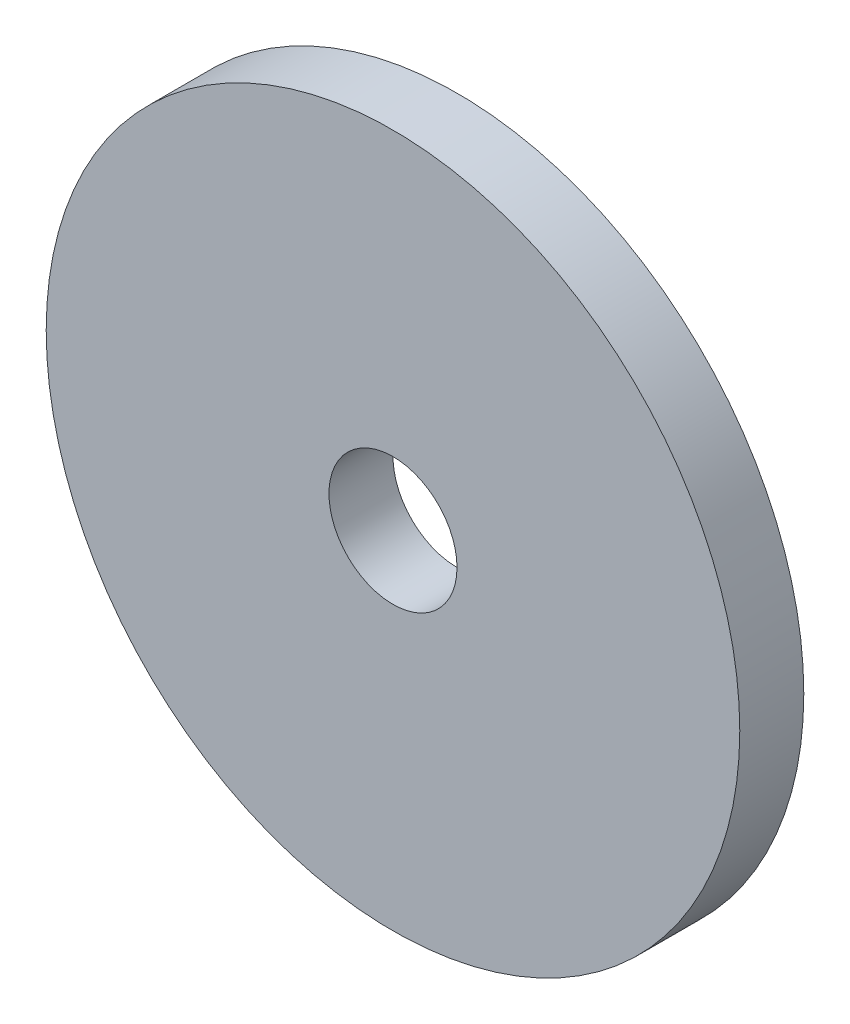
ISO-10303-21;
HEADER;
FILE_DESCRIPTION(('STEP AP214'),'2;1');
FILE_NAME('part.step','',(''),(''),'','','');
FILE_SCHEMA(('AUTOMOTIVE_DESIGN { 1 0 10303 214 1 1 1 1 }'));
ENDSEC;
DATA;
#1=APPLICATION_CONTEXT('core data for automotive mechanical design processes');
#2=APPLICATION_PROTOCOL_DEFINITION('international standard','automotive_design',2000,#1);
#3=PRODUCT_CONTEXT('',#1,'mechanical');
#4=PRODUCT('Part','Part','',(#3));
#5=PRODUCT_RELATED_PRODUCT_CATEGORY('part','',(#4));
#6=PRODUCT_DEFINITION_FORMATION('','',#4);
#7=PRODUCT_DEFINITION_CONTEXT('part definition',#1,'design');
#8=PRODUCT_DEFINITION('design','',#6,#7);
#9=PRODUCT_DEFINITION_SHAPE('','',#8);
#10=(LENGTH_UNIT() NAMED_UNIT(*) SI_UNIT(.MILLI.,.METRE.));
#11=(NAMED_UNIT(*) PLANE_ANGLE_UNIT() SI_UNIT($,.RADIAN.));
#12=(NAMED_UNIT(*) SI_UNIT($,.STERADIAN.) SOLID_ANGLE_UNIT());
#13=UNCERTAINTY_MEASURE_WITH_UNIT(LENGTH_MEASURE(1.E-05),#10,'distance_accuracy_value','');
#14=(GEOMETRIC_REPRESENTATION_CONTEXT(3) GLOBAL_UNCERTAINTY_ASSIGNED_CONTEXT((#13)) GLOBAL_UNIT_ASSIGNED_CONTEXT((#10,
#11,#12)) REPRESENTATION_CONTEXT('',''));
#15=CARTESIAN_POINT('',(0.,0.,0.));
#16=DIRECTION('',(0.,0.,1.));
#17=DIRECTION('',(1.,0.,0.));
#18=AXIS2_PLACEMENT_3D('',#15,#16,#17);
#19=CARTESIAN_POINT('',(0.,0.,3.));
#20=DIRECTION('',(0.,0.,1.));
#21=DIRECTION('',(1.,0.,0.));
#22=AXIS2_PLACEMENT_3D('',#19,#20,#21);
#23=PLANE('',#22);
#24=CARTESIAN_POINT('',(0.,0.,3.));
#25=DIRECTION('',(0.,0.,1.));
#26=DIRECTION('',(1.,0.,0.));
#27=AXIS2_PLACEMENT_3D('',#24,#25,#26);
#28=CIRCLE('',#27,32.5);
#29=CARTESIAN_POINT('',(32.5,0.,3.));
#30=VERTEX_POINT('',#29);
#31=EDGE_CURVE('E10',#30,#30,#28,.T.);
#32=ORIENTED_EDGE('',*,*,#31,.T.);
#33=EDGE_LOOP('',(#32));
#34=FACE_BOUND('',#33,.T.);
#35=CARTESIAN_POINT('',(0.,0.,3.));
#36=DIRECTION('',(0.,0.,1.));
#37=DIRECTION('',(1.,0.,0.));
#38=AXIS2_PLACEMENT_3D('',#35,#36,#37);
#39=CIRCLE('',#38,6.);
#40=CARTESIAN_POINT('',(6.,0.,3.));
#41=VERTEX_POINT('',#40);
#42=EDGE_CURVE('E50',#41,#41,#39,.T.);
#43=ORIENTED_EDGE('',*,*,#42,.F.);
#44=EDGE_LOOP('',(#43));
#45=FACE_BOUND('',#44,.T.);
#46=ADVANCED_FACE('F37',(#34,#45),#23,.T.);
#47=CARTESIAN_POINT('',(0.,0.,-3.));
#48=DIRECTION('',(0.,0.,1.));
#49=DIRECTION('',(1.,0.,0.));
#50=AXIS2_PLACEMENT_3D('',#47,#48,#49);
#51=PLANE('',#50);
#52=CARTESIAN_POINT('',(0.,0.,-3.));
#53=DIRECTION('',(0.,0.,1.));
#54=DIRECTION('',(1.,0.,0.));
#55=AXIS2_PLACEMENT_3D('',#52,#53,#54);
#56=CIRCLE('',#55,32.5);
#57=CARTESIAN_POINT('',(32.5,0.,-3.));
#58=VERTEX_POINT('',#57);
#59=EDGE_CURVE('E41',#58,#58,#56,.T.);
#60=ORIENTED_EDGE('',*,*,#59,.F.);
#61=EDGE_LOOP('',(#60));
#62=FACE_BOUND('',#61,.T.);
#63=CARTESIAN_POINT('',(0.,0.,-3.));
#64=DIRECTION('',(0.,0.,1.));
#65=DIRECTION('',(1.,0.,0.));
#66=AXIS2_PLACEMENT_3D('',#63,#64,#65);
#67=CIRCLE('',#66,6.);
#68=CARTESIAN_POINT('',(6.,0.,-3.));
#69=VERTEX_POINT('',#68);
#70=EDGE_CURVE('E52',#69,#69,#67,.T.);
#71=ORIENTED_EDGE('',*,*,#70,.T.);
#72=EDGE_LOOP('',(#71));
#73=FACE_BOUND('',#72,.T.);
#74=ADVANCED_FACE('F64',(#62,#73),#51,.F.);
#75=CARTESIAN_POINT('',(0.,0.,3.));
#76=DIRECTION('',(0.,0.,-1.));
#77=DIRECTION('',(-1.,0.,0.));
#78=AXIS2_PLACEMENT_3D('',#75,#76,#77);
#79=CYLINDRICAL_SURFACE('',#78,32.5);
#80=ORIENTED_EDGE('',*,*,#31,.F.);
#81=EDGE_LOOP('',(#80));
#82=FACE_BOUND('',#81,.T.);
#83=ORIENTED_EDGE('',*,*,#59,.T.);
#84=EDGE_LOOP('',(#83));
#85=FACE_BOUND('',#84,.T.);
#86=ADVANCED_FACE('F39',(#82,#85),#79,.T.);
#87=CARTESIAN_POINT('',(0.,0.,3.));
#88=DIRECTION('',(0.,0.,-1.));
#89=DIRECTION('',(-1.,0.,0.));
#90=AXIS2_PLACEMENT_3D('',#87,#88,#89);
#91=CYLINDRICAL_SURFACE('',#90,6.);
#92=ORIENTED_EDGE('',*,*,#42,.T.);
#93=EDGE_LOOP('',(#92));
#94=FACE_BOUND('',#93,.T.);
#95=ORIENTED_EDGE('',*,*,#70,.F.);
#96=EDGE_LOOP('',(#95));
#97=FACE_BOUND('',#96,.T.);
#98=ADVANCED_FACE('F60',(#94,#97),#91,.F.);
#99=CLOSED_SHELL('',(#46,#74,#86,#98));
#100=MANIFOLD_SOLID_BREP('B2',#99);
#101=ADVANCED_BREP_SHAPE_REPRESENTATION('',(#18,#100),#14);
#102=SHAPE_DEFINITION_REPRESENTATION(#9,#101);
ENDSEC;
END-ISO-10303-21;
